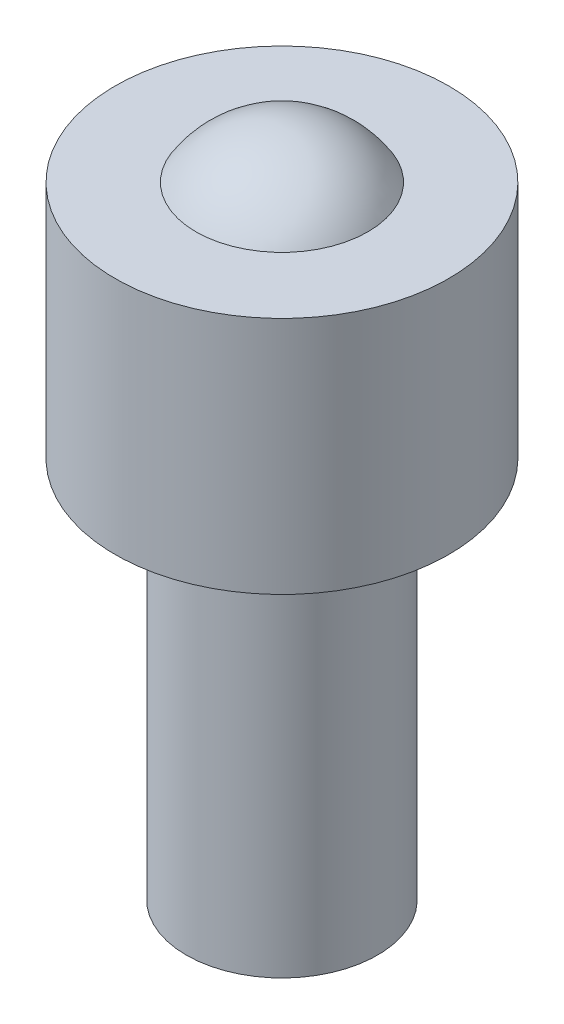
ISO-10303-21;
HEADER;
FILE_DESCRIPTION(('STEP AP214'),'2;1');
FILE_NAME('part.step','',(''),(''),'','','');
FILE_SCHEMA(('AUTOMOTIVE_DESIGN { 1 0 10303 214 1 1 1 1 }'));
ENDSEC;
DATA;
#1=APPLICATION_CONTEXT('core data for automotive mechanical design processes');
#2=APPLICATION_PROTOCOL_DEFINITION('international standard','automotive_design',2000,#1);
#3=PRODUCT_CONTEXT('',#1,'mechanical');
#4=PRODUCT('Part','Part','',(#3));
#5=PRODUCT_RELATED_PRODUCT_CATEGORY('part','',(#4));
#6=PRODUCT_DEFINITION_FORMATION('','',#4);
#7=PRODUCT_DEFINITION_CONTEXT('part definition',#1,'design');
#8=PRODUCT_DEFINITION('design','',#6,#7);
#9=PRODUCT_DEFINITION_SHAPE('','',#8);
#10=(LENGTH_UNIT() NAMED_UNIT(*) SI_UNIT(.MILLI.,.METRE.));
#11=(NAMED_UNIT(*) PLANE_ANGLE_UNIT() SI_UNIT($,.RADIAN.));
#12=(NAMED_UNIT(*) SI_UNIT($,.STERADIAN.) SOLID_ANGLE_UNIT());
#13=UNCERTAINTY_MEASURE_WITH_UNIT(LENGTH_MEASURE(1.E-05),#10,'distance_accuracy_value','');
#14=(GEOMETRIC_REPRESENTATION_CONTEXT(3) GLOBAL_UNCERTAINTY_ASSIGNED_CONTEXT((#13)) GLOBAL_UNIT_ASSIGNED_CONTEXT((#10,
#11,#12)) REPRESENTATION_CONTEXT('',''));
#15=CARTESIAN_POINT('',(0.,0.,0.));
#16=DIRECTION('',(0.,0.,1.));
#17=DIRECTION('',(1.,0.,0.));
#18=AXIS2_PLACEMENT_3D('',#15,#16,#17);
#19=CARTESIAN_POINT('',(0.,0.,0.));
#20=DIRECTION('',(0.,-1.,0.));
#21=DIRECTION('',(1.,0.,0.));
#22=AXIS2_PLACEMENT_3D('',#19,#20,#21);
#23=SPHERICAL_SURFACE('',#22,3.175);
#24=CARTESIAN_POINT('',(0.,1.675,0.));
#25=DIRECTION('',(0.,-1.,0.));
#26=DIRECTION('',(0.,0.,-1.));
#27=AXIS2_PLACEMENT_3D('',#24,#25,#26);
#28=CIRCLE('',#27,2.69722079185224);
#29=CARTESIAN_POINT('',(0.,1.675,-2.69722079185224));
#30=VERTEX_POINT('',#29);
#31=EDGE_CURVE('E52',#30,#30,#28,.T.);
#32=ORIENTED_EDGE('',*,*,#31,.F.);
#33=EDGE_LOOP('',(#32));
#34=FACE_BOUND('',#33,.T.);
#35=ADVANCED_FACE('F33',(#34),#23,.T.);
#36=CARTESIAN_POINT('',(3.,-17.825,0.));
#37=DIRECTION('',(0.,-1.,0.));
#38=DIRECTION('',(0.,0.,-1.));
#39=AXIS2_PLACEMENT_3D('',#36,#37,#38);
#40=PLANE('',#39);
#41=CARTESIAN_POINT('',(0.,-17.825,0.));
#42=DIRECTION('',(0.,-1.,0.));
#43=DIRECTION('',(0.,0.,-1.));
#44=AXIS2_PLACEMENT_3D('',#41,#42,#43);
#45=CIRCLE('',#44,3.);
#46=CARTESIAN_POINT('',(0.,-17.825,-3.));
#47=VERTEX_POINT('',#46);
#48=EDGE_CURVE('E10',#47,#47,#45,.T.);
#49=ORIENTED_EDGE('',*,*,#48,.T.);
#50=EDGE_LOOP('',(#49));
#51=FACE_BOUND('',#50,.T.);
#52=ADVANCED_FACE('F60',(#51),#40,.T.);
#53=CARTESIAN_POINT('',(0.,-17.825,0.));
#54=DIRECTION('',(0.,-1.,0.));
#55=DIRECTION('',(0.,0.,-1.));
#56=AXIS2_PLACEMENT_3D('',#53,#54,#55);
#57=CYLINDRICAL_SURFACE('',#56,3.);
#58=CARTESIAN_POINT('',(0.,-5.825,0.));
#59=DIRECTION('',(0.,-1.,0.));
#60=DIRECTION('',(0.,0.,-1.));
#61=AXIS2_PLACEMENT_3D('',#58,#59,#60);
#62=CIRCLE('',#61,3.);
#63=CARTESIAN_POINT('',(0.,-5.825,-3.));
#64=VERTEX_POINT('',#63);
#65=EDGE_CURVE('E39',#64,#64,#62,.T.);
#66=ORIENTED_EDGE('',*,*,#65,.T.);
#67=EDGE_LOOP('',(#66));
#68=FACE_BOUND('',#67,.T.);
#69=ORIENTED_EDGE('',*,*,#48,.F.);
#70=EDGE_LOOP('',(#69));
#71=FACE_BOUND('',#70,.T.);
#72=ADVANCED_FACE('F64',(#68,#71),#57,.T.);
#73=CARTESIAN_POINT('',(5.23412827193007,-5.825,0.));
#74=DIRECTION('',(0.,-1.,0.));
#75=DIRECTION('',(0.,0.,-1.));
#76=AXIS2_PLACEMENT_3D('',#73,#74,#75);
#77=PLANE('',#76);
#78=CARTESIAN_POINT('',(0.,-5.825,0.));
#79=DIRECTION('',(0.,-1.,0.));
#80=DIRECTION('',(0.,0.,-1.));
#81=AXIS2_PLACEMENT_3D('',#78,#79,#80);
#82=CIRCLE('',#81,5.23412827193007);
#83=CARTESIAN_POINT('',(0.,-5.825,-5.23412827193007));
#84=VERTEX_POINT('',#83);
#85=EDGE_CURVE('E43',#84,#84,#82,.T.);
#86=ORIENTED_EDGE('',*,*,#85,.T.);
#87=EDGE_LOOP('',(#86));
#88=FACE_BOUND('',#87,.T.);
#89=ORIENTED_EDGE('',*,*,#65,.F.);
#90=EDGE_LOOP('',(#89));
#91=FACE_BOUND('',#90,.T.);
#92=ADVANCED_FACE('F68',(#88,#91),#77,.T.);
#93=CARTESIAN_POINT('',(0.,-17.825,0.));
#94=DIRECTION('',(0.,-1.,0.));
#95=DIRECTION('',(0.,0.,-1.));
#96=AXIS2_PLACEMENT_3D('',#93,#94,#95);
#97=CYLINDRICAL_SURFACE('',#96,5.23412827193007);
#98=CARTESIAN_POINT('',(0.,1.675,0.));
#99=DIRECTION('',(0.,-1.,0.));
#100=DIRECTION('',(0.,0.,-1.));
#101=AXIS2_PLACEMENT_3D('',#98,#99,#100);
#102=CIRCLE('',#101,5.23412827193007);
#103=CARTESIAN_POINT('',(0.,1.675,-5.23412827193007));
#104=VERTEX_POINT('',#103);
#105=EDGE_CURVE('E47',#104,#104,#102,.T.);
#106=ORIENTED_EDGE('',*,*,#105,.T.);
#107=EDGE_LOOP('',(#106));
#108=FACE_BOUND('',#107,.T.);
#109=ORIENTED_EDGE('',*,*,#85,.F.);
#110=EDGE_LOOP('',(#109));
#111=FACE_BOUND('',#110,.T.);
#112=ADVANCED_FACE('F73',(#108,#111),#97,.T.);
#113=CARTESIAN_POINT('',(2.69722079185224,1.675,0.));
#114=DIRECTION('',(0.,1.,0.));
#115=DIRECTION('',(0.,0.,1.));
#116=AXIS2_PLACEMENT_3D('',#113,#114,#115);
#117=PLANE('',#116);
#118=ORIENTED_EDGE('',*,*,#31,.T.);
#119=EDGE_LOOP('',(#118));
#120=FACE_BOUND('',#119,.T.);
#121=ORIENTED_EDGE('',*,*,#105,.F.);
#122=EDGE_LOOP('',(#121));
#123=FACE_BOUND('',#122,.T.);
#124=ADVANCED_FACE('F56',(#120,#123),#117,.T.);
#125=CLOSED_SHELL('',(#35,#52,#72,#92,#112,#124));
#126=MANIFOLD_SOLID_BREP('B2',#125);
#127=ADVANCED_BREP_SHAPE_REPRESENTATION('',(#18,#126),#14);
#128=SHAPE_DEFINITION_REPRESENTATION(#9,#127);
ENDSEC;
END-ISO-10303-21;
